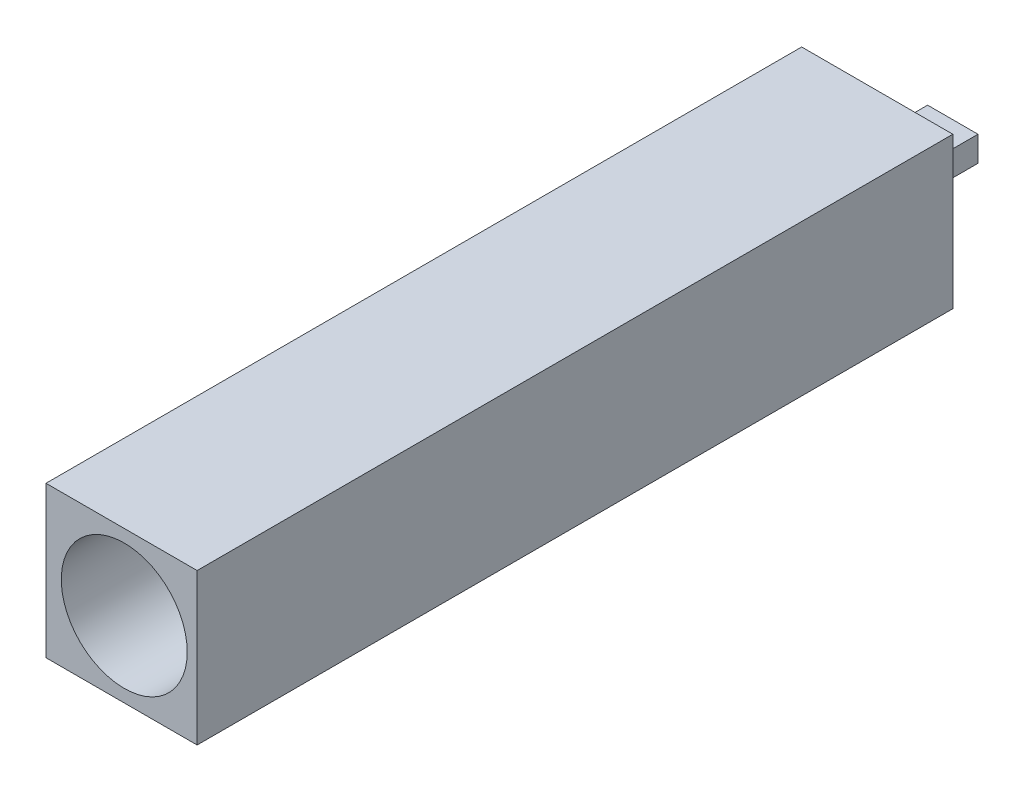
ISO-10303-21;
HEADER;
FILE_DESCRIPTION(('STEP AP214'),'2;1');
FILE_NAME('part.step','',(''),(''),'','','');
FILE_SCHEMA(('AUTOMOTIVE_DESIGN { 1 0 10303 214 1 1 1 1 }'));
ENDSEC;
DATA;
#1=APPLICATION_CONTEXT('core data for automotive mechanical design processes');
#2=APPLICATION_PROTOCOL_DEFINITION('international standard','automotive_design',2000,#1);
#3=PRODUCT_CONTEXT('',#1,'mechanical');
#4=PRODUCT('Part','Part','',(#3));
#5=PRODUCT_RELATED_PRODUCT_CATEGORY('part','',(#4));
#6=PRODUCT_DEFINITION_FORMATION('','',#4);
#7=PRODUCT_DEFINITION_CONTEXT('part definition',#1,'design');
#8=PRODUCT_DEFINITION('design','',#6,#7);
#9=PRODUCT_DEFINITION_SHAPE('','',#8);
#10=(LENGTH_UNIT() NAMED_UNIT(*) SI_UNIT(.MILLI.,.METRE.));
#11=(NAMED_UNIT(*) PLANE_ANGLE_UNIT() SI_UNIT($,.RADIAN.));
#12=(NAMED_UNIT(*) SI_UNIT($,.STERADIAN.) SOLID_ANGLE_UNIT());
#13=UNCERTAINTY_MEASURE_WITH_UNIT(LENGTH_MEASURE(1.E-05),#10,'distance_accuracy_value','');
#14=(GEOMETRIC_REPRESENTATION_CONTEXT(3) GLOBAL_UNCERTAINTY_ASSIGNED_CONTEXT((#13)) GLOBAL_UNIT_ASSIGNED_CONTEXT((#10,
#11,#12)) REPRESENTATION_CONTEXT('',''));
#15=CARTESIAN_POINT('',(0.,0.,0.));
#16=DIRECTION('',(0.,0.,1.));
#17=DIRECTION('',(1.,0.,0.));
#18=AXIS2_PLACEMENT_3D('',#15,#16,#17);
#19=CARTESIAN_POINT('',(0.,0.,0.));
#20=DIRECTION('',(0.,0.,1.));
#21=DIRECTION('',(1.,0.,0.));
#22=AXIS2_PLACEMENT_3D('',#19,#20,#21);
#23=PLANE('',#22);
#24=DIRECTION('',(0.,1.,0.));
#25=VECTOR('',#24,1.);
#26=CARTESIAN_POINT('',(0.,0.,0.));
#27=LINE('',#26,#25);
#28=CARTESIAN_POINT('',(0.,0.,0.));
#29=VERTEX_POINT('',#28);
#30=CARTESIAN_POINT('',(0.,30.,0.));
#31=VERTEX_POINT('',#30);
#32=EDGE_CURVE('E129',#29,#31,#27,.T.);
#33=ORIENTED_EDGE('',*,*,#32,.F.);
#34=DIRECTION('',(1.,0.,0.));
#35=VECTOR('',#34,1.);
#36=CARTESIAN_POINT('',(0.,0.,0.));
#37=LINE('',#36,#35);
#38=CARTESIAN_POINT('',(-30.,0.,0.));
#39=VERTEX_POINT('',#38);
#40=EDGE_CURVE('E135',#39,#29,#37,.T.);
#41=ORIENTED_EDGE('',*,*,#40,.F.);
#42=DIRECTION('',(0.,-1.,0.));
#43=VECTOR('',#42,1.);
#44=CARTESIAN_POINT('',(-30.,0.,0.));
#45=LINE('',#44,#43);
#46=CARTESIAN_POINT('',(-30.,30.,0.));
#47=VERTEX_POINT('',#46);
#48=EDGE_CURVE('E146',#47,#39,#45,.T.);
#49=ORIENTED_EDGE('',*,*,#48,.F.);
#50=DIRECTION('',(-1.,0.,0.));
#51=VECTOR('',#50,1.);
#52=CARTESIAN_POINT('',(0.,30.,0.));
#53=LINE('',#52,#51);
#54=EDGE_CURVE('E144',#31,#47,#53,.T.);
#55=ORIENTED_EDGE('',*,*,#54,.F.);
#56=EDGE_LOOP('',(#33,#41,#49,#55));
#57=FACE_BOUND('',#56,.T.);
#58=DIRECTION('',(0.,1.,0.));
#59=VECTOR('',#58,1.);
#60=CARTESIAN_POINT('',(-20.,12.5,0.));
#61=LINE('',#60,#59);
#62=CARTESIAN_POINT('',(-20.,12.5,0.));
#63=VERTEX_POINT('',#62);
#64=CARTESIAN_POINT('',(-20.,17.5,0.));
#65=VERTEX_POINT('',#64);
#66=EDGE_CURVE('E49',#63,#65,#61,.T.);
#67=ORIENTED_EDGE('',*,*,#66,.F.);
#68=DIRECTION('',(-1.,0.,0.));
#69=VECTOR('',#68,1.);
#70=CARTESIAN_POINT('',(-20.,12.5,0.));
#71=LINE('',#70,#69);
#72=CARTESIAN_POINT('',(-10.,12.5,0.));
#73=VERTEX_POINT('',#72);
#74=EDGE_CURVE('E53',#73,#63,#71,.T.);
#75=ORIENTED_EDGE('',*,*,#74,.F.);
#76=DIRECTION('',(0.,-1.,0.));
#77=VECTOR('',#76,1.);
#78=CARTESIAN_POINT('',(-10.,12.5,0.));
#79=LINE('',#78,#77);
#80=CARTESIAN_POINT('',(-9.99999999999999,17.5,0.));
#81=VERTEX_POINT('',#80);
#82=EDGE_CURVE('E243',#81,#73,#79,.T.);
#83=ORIENTED_EDGE('',*,*,#82,.F.);
#84=DIRECTION('',(1.,0.,0.));
#85=VECTOR('',#84,1.);
#86=CARTESIAN_POINT('',(-20.,17.5,0.));
#87=LINE('',#86,#85);
#88=EDGE_CURVE('E235',#65,#81,#87,.T.);
#89=ORIENTED_EDGE('',*,*,#88,.F.);
#90=EDGE_LOOP('',(#67,#75,#83,#89));
#91=FACE_BOUND('',#90,.T.);
#92=ADVANCED_FACE('F34',(#57,#91),#23,.F.);
#93=CARTESIAN_POINT('',(0.,0.,150.));
#94=DIRECTION('',(-1.,0.,0.));
#95=DIRECTION('',(0.,-1.,0.));
#96=AXIS2_PLACEMENT_3D('',#93,#94,#95);
#97=PLANE('',#96);
#98=ORIENTED_EDGE('',*,*,#32,.T.);
#99=DIRECTION('',(0.,0.,-1.));
#100=VECTOR('',#99,1.);
#101=CARTESIAN_POINT('',(0.,30.,150.));
#102=LINE('',#101,#100);
#103=CARTESIAN_POINT('',(0.,30.,150.));
#104=VERTEX_POINT('',#103);
#105=EDGE_CURVE('E11',#104,#31,#102,.T.);
#106=ORIENTED_EDGE('',*,*,#105,.F.);
#107=DIRECTION('',(0.,1.,0.));
#108=VECTOR('',#107,1.);
#109=CARTESIAN_POINT('',(0.,0.,150.));
#110=LINE('',#109,#108);
#111=CARTESIAN_POINT('',(0.,0.,150.));
#112=VERTEX_POINT('',#111);
#113=EDGE_CURVE('E131',#112,#104,#110,.T.);
#114=ORIENTED_EDGE('',*,*,#113,.F.);
#115=DIRECTION('',(0.,0.,-1.));
#116=VECTOR('',#115,1.);
#117=CARTESIAN_POINT('',(0.,0.,150.));
#118=LINE('',#117,#116);
#119=EDGE_CURVE('E141',#112,#29,#118,.T.);
#120=ORIENTED_EDGE('',*,*,#119,.T.);
#121=EDGE_LOOP('',(#98,#106,#114,#120));
#122=FACE_BOUND('',#121,.T.);
#123=ADVANCED_FACE('F36',(#122),#97,.F.);
#124=CARTESIAN_POINT('',(0.,30.,150.));
#125=DIRECTION('',(0.,-1.,0.));
#126=DIRECTION('',(1.,0.,0.));
#127=AXIS2_PLACEMENT_3D('',#124,#125,#126);
#128=PLANE('',#127);
#129=ORIENTED_EDGE('',*,*,#54,.T.);
#130=DIRECTION('',(0.,0.,-1.));
#131=VECTOR('',#130,1.);
#132=CARTESIAN_POINT('',(-30.,30.,150.));
#133=LINE('',#132,#131);
#134=CARTESIAN_POINT('',(-30.,30.,150.));
#135=VERTEX_POINT('',#134);
#136=EDGE_CURVE('E42',#135,#47,#133,.T.);
#137=ORIENTED_EDGE('',*,*,#136,.F.);
#138=DIRECTION('',(-1.,0.,0.));
#139=VECTOR('',#138,1.);
#140=CARTESIAN_POINT('',(0.,30.,150.));
#141=LINE('',#140,#139);
#142=EDGE_CURVE('E134',#104,#135,#141,.T.);
#143=ORIENTED_EDGE('',*,*,#142,.F.);
#144=ORIENTED_EDGE('',*,*,#105,.T.);
#145=EDGE_LOOP('',(#129,#137,#143,#144));
#146=FACE_BOUND('',#145,.T.);
#147=ADVANCED_FACE('F173',(#146),#128,.F.);
#148=CARTESIAN_POINT('',(-30.,0.,150.));
#149=DIRECTION('',(1.,0.,0.));
#150=DIRECTION('',(0.,0.,-1.));
#151=AXIS2_PLACEMENT_3D('',#148,#149,#150);
#152=PLANE('',#151);
#153=ORIENTED_EDGE('',*,*,#48,.T.);
#154=DIRECTION('',(0.,0.,-1.));
#155=VECTOR('',#154,1.);
#156=CARTESIAN_POINT('',(-30.,0.,150.));
#157=LINE('',#156,#155);
#158=CARTESIAN_POINT('',(-30.,0.,150.));
#159=VERTEX_POINT('',#158);
#160=EDGE_CURVE('E151',#159,#39,#157,.T.);
#161=ORIENTED_EDGE('',*,*,#160,.F.);
#162=DIRECTION('',(0.,-1.,0.));
#163=VECTOR('',#162,1.);
#164=CARTESIAN_POINT('',(-30.,0.,150.));
#165=LINE('',#164,#163);
#166=EDGE_CURVE('E137',#135,#159,#165,.T.);
#167=ORIENTED_EDGE('',*,*,#166,.F.);
#168=ORIENTED_EDGE('',*,*,#136,.T.);
#169=EDGE_LOOP('',(#153,#161,#167,#168));
#170=FACE_BOUND('',#169,.T.);
#171=ADVANCED_FACE('F158',(#170),#152,.F.);
#172=CARTESIAN_POINT('',(0.,0.,150.));
#173=DIRECTION('',(0.,1.,0.));
#174=DIRECTION('',(0.,0.,1.));
#175=AXIS2_PLACEMENT_3D('',#172,#173,#174);
#176=PLANE('',#175);
#177=ORIENTED_EDGE('',*,*,#40,.T.);
#178=ORIENTED_EDGE('',*,*,#119,.F.);
#179=DIRECTION('',(1.,0.,0.));
#180=VECTOR('',#179,1.);
#181=CARTESIAN_POINT('',(0.,0.,150.));
#182=LINE('',#181,#180);
#183=EDGE_CURVE('E139',#159,#112,#182,.T.);
#184=ORIENTED_EDGE('',*,*,#183,.F.);
#185=ORIENTED_EDGE('',*,*,#160,.T.);
#186=EDGE_LOOP('',(#177,#178,#184,#185));
#187=FACE_BOUND('',#186,.T.);
#188=ADVANCED_FACE('F166',(#187),#176,.F.);
#189=CARTESIAN_POINT('',(0.,0.,150.));
#190=DIRECTION('',(0.,0.,1.));
#191=DIRECTION('',(1.,0.,0.));
#192=AXIS2_PLACEMENT_3D('',#189,#190,#191);
#193=PLANE('',#192);
#194=CARTESIAN_POINT('',(-14.4685043406483,15.,150.));
#195=DIRECTION('',(0.,0.,1.));
#196=DIRECTION('',(1.,0.,0.));
#197=AXIS2_PLACEMENT_3D('',#194,#195,#196);
#198=CIRCLE('',#197,12.5);
#199=CARTESIAN_POINT('',(-1.96850434064828,15.,150.));
#200=VERTEX_POINT('',#199);
#201=EDGE_CURVE('E119',#200,#200,#198,.T.);
#202=ORIENTED_EDGE('',*,*,#201,.F.);
#203=EDGE_LOOP('',(#202));
#204=FACE_BOUND('',#203,.T.);
#205=ORIENTED_EDGE('',*,*,#113,.T.);
#206=ORIENTED_EDGE('',*,*,#142,.T.);
#207=ORIENTED_EDGE('',*,*,#166,.T.);
#208=ORIENTED_EDGE('',*,*,#183,.T.);
#209=EDGE_LOOP('',(#205,#206,#207,#208));
#210=FACE_BOUND('',#209,.T.);
#211=ADVANCED_FACE('F172',(#204,#210),#193,.T.);
#212=CARTESIAN_POINT('',(-14.4685043406483,15.,30.));
#213=DIRECTION('',(0.,0.,1.));
#214=DIRECTION('',(1.,0.,0.));
#215=AXIS2_PLACEMENT_3D('',#212,#213,#214);
#216=CYLINDRICAL_SURFACE('',#215,12.5);
#217=CARTESIAN_POINT('',(-14.4685043406483,15.,30.));
#218=DIRECTION('',(0.,0.,1.));
#219=DIRECTION('',(1.,0.,0.));
#220=AXIS2_PLACEMENT_3D('',#217,#218,#219);
#221=CIRCLE('',#220,12.5);
#222=CARTESIAN_POINT('',(-1.96850434064828,15.,30.));
#223=VERTEX_POINT('',#222);
#224=EDGE_CURVE('E122',#223,#223,#221,.T.);
#225=ORIENTED_EDGE('',*,*,#224,.F.);
#226=EDGE_LOOP('',(#225));
#227=FACE_BOUND('',#226,.T.);
#228=ORIENTED_EDGE('',*,*,#201,.T.);
#229=EDGE_LOOP('',(#228));
#230=FACE_BOUND('',#229,.T.);
#231=ADVANCED_FACE('F191',(#227,#230),#216,.F.);
#232=CARTESIAN_POINT('',(-14.4685043406483,15.,30.));
#233=DIRECTION('',(0.,0.,1.));
#234=DIRECTION('',(1.,0.,0.));
#235=AXIS2_PLACEMENT_3D('',#232,#233,#234);
#236=PLANE('',#235);
#237=ORIENTED_EDGE('',*,*,#224,.T.);
#238=EDGE_LOOP('',(#237));
#239=FACE_BOUND('',#238,.T.);
#240=ADVANCED_FACE('F196',(#239),#236,.T.);
#241=CARTESIAN_POINT('',(-20.,12.5,-15.));
#242=DIRECTION('',(1.,0.,0.));
#243=DIRECTION('',(0.,0.,-1.));
#244=AXIS2_PLACEMENT_3D('',#241,#242,#243);
#245=PLANE('',#244);
#246=ORIENTED_EDGE('',*,*,#66,.T.);
#247=DIRECTION('',(0.,0.,1.));
#248=VECTOR('',#247,1.);
#249=CARTESIAN_POINT('',(-20.,17.5,-15.));
#250=LINE('',#249,#248);
#251=CARTESIAN_POINT('',(-20.,17.5,-15.));
#252=VERTEX_POINT('',#251);
#253=EDGE_CURVE('E102',#252,#65,#250,.T.);
#254=ORIENTED_EDGE('',*,*,#253,.F.);
#255=DIRECTION('',(0.,1.,0.));
#256=VECTOR('',#255,1.);
#257=CARTESIAN_POINT('',(-20.,12.5,-15.));
#258=LINE('',#257,#256);
#259=CARTESIAN_POINT('',(-20.,12.5,-15.));
#260=VERTEX_POINT('',#259);
#261=EDGE_CURVE('E108',#260,#252,#258,.T.);
#262=ORIENTED_EDGE('',*,*,#261,.F.);
#263=DIRECTION('',(0.,0.,1.));
#264=VECTOR('',#263,1.);
#265=CARTESIAN_POINT('',(-20.,12.5,-15.));
#266=LINE('',#265,#264);
#267=EDGE_CURVE('E240',#260,#63,#266,.T.);
#268=ORIENTED_EDGE('',*,*,#267,.T.);
#269=EDGE_LOOP('',(#246,#254,#262,#268));
#270=FACE_BOUND('',#269,.T.);
#271=ADVANCED_FACE('F118',(#270),#245,.F.);
#272=CARTESIAN_POINT('',(-20.,17.5,-15.));
#273=DIRECTION('',(0.,-1.,0.));
#274=DIRECTION('',(1.,0.,0.));
#275=AXIS2_PLACEMENT_3D('',#272,#273,#274);
#276=PLANE('',#275);
#277=CARTESIAN_POINT('',(-15.,17.5,-10.));
#278=DIRECTION('',(0.,-1.,0.));
#279=DIRECTION('',(1.,0.,0.));
#280=AXIS2_PLACEMENT_3D('',#277,#278,#279);
#281=CIRCLE('',#280,2.5);
#282=CARTESIAN_POINT('',(-12.5,17.5,-10.));
#283=VERTEX_POINT('',#282);
#284=EDGE_CURVE('E233',#283,#283,#281,.T.);
#285=ORIENTED_EDGE('',*,*,#284,.T.);
#286=EDGE_LOOP('',(#285));
#287=FACE_BOUND('',#286,.T.);
#288=ORIENTED_EDGE('',*,*,#88,.T.);
#289=DIRECTION('',(0.,0.,1.));
#290=VECTOR('',#289,1.);
#291=CARTESIAN_POINT('',(-9.99999999999999,17.5,-15.));
#292=LINE('',#291,#290);
#293=CARTESIAN_POINT('',(-9.99999999999999,17.5,-15.));
#294=VERTEX_POINT('',#293);
#295=EDGE_CURVE('E104',#294,#81,#292,.T.);
#296=ORIENTED_EDGE('',*,*,#295,.F.);
#297=DIRECTION('',(1.,0.,0.));
#298=VECTOR('',#297,1.);
#299=CARTESIAN_POINT('',(-20.,17.5,-15.));
#300=LINE('',#299,#298);
#301=EDGE_CURVE('E97',#252,#294,#300,.T.);
#302=ORIENTED_EDGE('',*,*,#301,.F.);
#303=ORIENTED_EDGE('',*,*,#253,.T.);
#304=EDGE_LOOP('',(#288,#296,#302,#303));
#305=FACE_BOUND('',#304,.T.);
#306=ADVANCED_FACE('F100',(#287,#305),#276,.F.);
#307=CARTESIAN_POINT('',(-10.,12.5,-15.));
#308=DIRECTION('',(-1.,0.,0.));
#309=DIRECTION('',(0.,-1.,0.));
#310=AXIS2_PLACEMENT_3D('',#307,#308,#309);
#311=PLANE('',#310);
#312=ORIENTED_EDGE('',*,*,#82,.T.);
#313=DIRECTION('',(0.,0.,1.));
#314=VECTOR('',#313,1.);
#315=CARTESIAN_POINT('',(-10.,12.5,-15.));
#316=LINE('',#315,#314);
#317=CARTESIAN_POINT('',(-10.,12.5,-15.));
#318=VERTEX_POINT('',#317);
#319=EDGE_CURVE('E124',#318,#73,#316,.T.);
#320=ORIENTED_EDGE('',*,*,#319,.F.);
#321=DIRECTION('',(0.,-1.,0.));
#322=VECTOR('',#321,1.);
#323=CARTESIAN_POINT('',(-10.,12.5,-15.));
#324=LINE('',#323,#322);
#325=EDGE_CURVE('E107',#294,#318,#324,.T.);
#326=ORIENTED_EDGE('',*,*,#325,.F.);
#327=ORIENTED_EDGE('',*,*,#295,.T.);
#328=EDGE_LOOP('',(#312,#320,#326,#327));
#329=FACE_BOUND('',#328,.T.);
#330=ADVANCED_FACE('F211',(#329),#311,.F.);
#331=CARTESIAN_POINT('',(-20.,12.5,-15.));
#332=DIRECTION('',(0.,1.,0.));
#333=DIRECTION('',(0.,0.,1.));
#334=AXIS2_PLACEMENT_3D('',#331,#332,#333);
#335=PLANE('',#334);
#336=CARTESIAN_POINT('',(-15.,12.5,-10.));
#337=DIRECTION('',(0.,-1.,0.));
#338=DIRECTION('',(0.,0.,-1.));
#339=AXIS2_PLACEMENT_3D('',#336,#337,#338);
#340=CIRCLE('',#339,2.5);
#341=CARTESIAN_POINT('',(-15.,12.5,-12.5));
#342=VERTEX_POINT('',#341);
#343=EDGE_CURVE('E230',#342,#342,#340,.T.);
#344=ORIENTED_EDGE('',*,*,#343,.F.);
#345=EDGE_LOOP('',(#344));
#346=FACE_BOUND('',#345,.T.);
#347=ORIENTED_EDGE('',*,*,#74,.T.);
#348=ORIENTED_EDGE('',*,*,#267,.F.);
#349=DIRECTION('',(-1.,0.,0.));
#350=VECTOR('',#349,1.);
#351=CARTESIAN_POINT('',(-20.,12.5,-15.));
#352=LINE('',#351,#350);
#353=EDGE_CURVE('E113',#318,#260,#352,.T.);
#354=ORIENTED_EDGE('',*,*,#353,.F.);
#355=ORIENTED_EDGE('',*,*,#319,.T.);
#356=EDGE_LOOP('',(#347,#348,#354,#355));
#357=FACE_BOUND('',#356,.T.);
#358=ADVANCED_FACE('F215',(#346,#357),#335,.F.);
#359=CARTESIAN_POINT('',(0.,0.,-15.));
#360=DIRECTION('',(0.,0.,-1.));
#361=DIRECTION('',(-1.,0.,0.));
#362=AXIS2_PLACEMENT_3D('',#359,#360,#361);
#363=PLANE('',#362);
#364=ORIENTED_EDGE('',*,*,#261,.T.);
#365=ORIENTED_EDGE('',*,*,#301,.T.);
#366=ORIENTED_EDGE('',*,*,#325,.T.);
#367=ORIENTED_EDGE('',*,*,#353,.T.);
#368=EDGE_LOOP('',(#364,#365,#366,#367));
#369=FACE_BOUND('',#368,.T.);
#370=ADVANCED_FACE('F111',(#369),#363,.T.);
#371=CARTESIAN_POINT('',(-15.,22.5,-10.));
#372=DIRECTION('',(0.,-1.,0.));
#373=DIRECTION('',(0.,0.,-1.));
#374=AXIS2_PLACEMENT_3D('',#371,#372,#373);
#375=CYLINDRICAL_SURFACE('',#374,2.5);
#376=ORIENTED_EDGE('',*,*,#343,.T.);
#377=EDGE_LOOP('',(#376));
#378=FACE_BOUND('',#377,.T.);
#379=ORIENTED_EDGE('',*,*,#284,.F.);
#380=EDGE_LOOP('',(#379));
#381=FACE_BOUND('',#380,.T.);
#382=ADVANCED_FACE('F222',(#378,#381),#375,.F.);
#383=CLOSED_SHELL('',(#92,#123,#147,#171,#188,#211,#231,#240,#271,#306,#330,#358,#370,#382));
#384=MANIFOLD_SOLID_BREP('B2',#383);
#385=ADVANCED_BREP_SHAPE_REPRESENTATION('',(#18,#384),#14);
#386=SHAPE_DEFINITION_REPRESENTATION(#9,#385);
ENDSEC;
END-ISO-10303-21;
